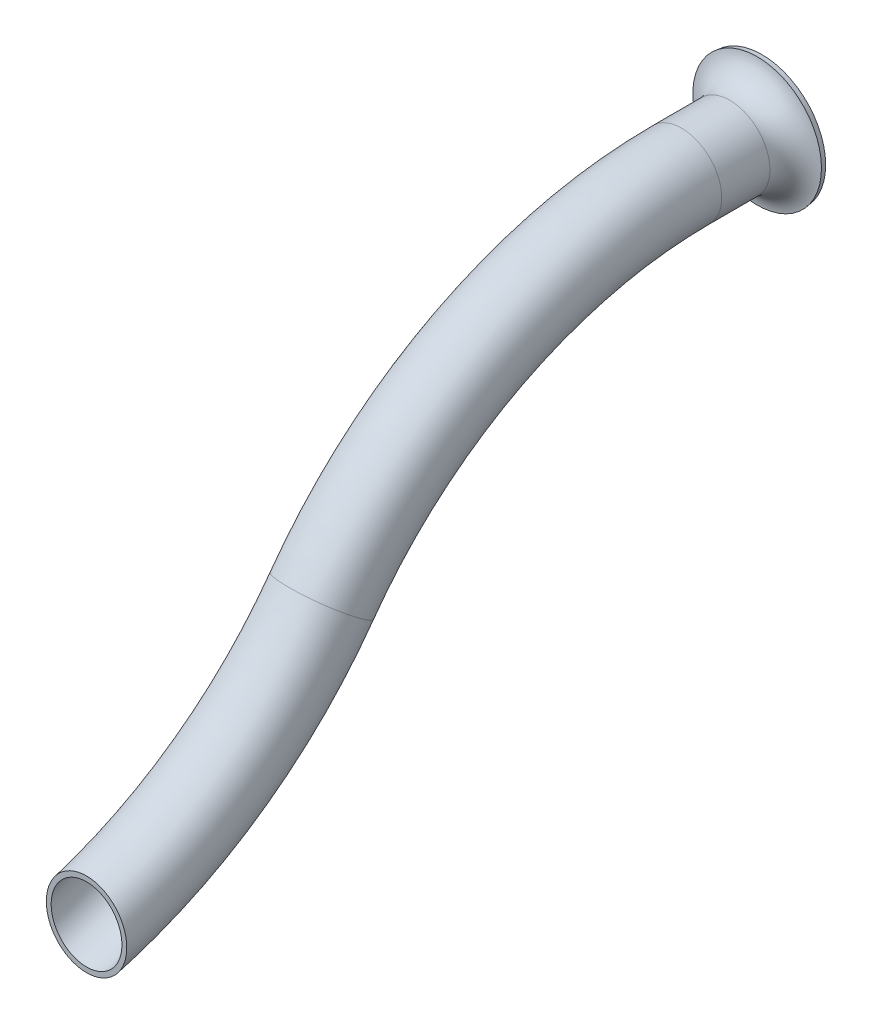
ISO-10303-21;
HEADER;
FILE_DESCRIPTION(('STEP AP214'),'2;1');
FILE_NAME('part.step','',(''),(''),'','','');
FILE_SCHEMA(('AUTOMOTIVE_DESIGN { 1 0 10303 214 1 1 1 1 }'));
ENDSEC;
DATA;
#1=APPLICATION_CONTEXT('core data for automotive mechanical design processes');
#2=APPLICATION_PROTOCOL_DEFINITION('international standard','automotive_design',2000,#1);
#3=PRODUCT_CONTEXT('',#1,'mechanical');
#4=PRODUCT('Part','Part','',(#3));
#5=PRODUCT_RELATED_PRODUCT_CATEGORY('part','',(#4));
#6=PRODUCT_DEFINITION_FORMATION('','',#4);
#7=PRODUCT_DEFINITION_CONTEXT('part definition',#1,'design');
#8=PRODUCT_DEFINITION('design','',#6,#7);
#9=PRODUCT_DEFINITION_SHAPE('','',#8);
#10=(LENGTH_UNIT() NAMED_UNIT(*) SI_UNIT(.MILLI.,.METRE.));
#11=(NAMED_UNIT(*) PLANE_ANGLE_UNIT() SI_UNIT($,.RADIAN.));
#12=(NAMED_UNIT(*) SI_UNIT($,.STERADIAN.) SOLID_ANGLE_UNIT());
#13=UNCERTAINTY_MEASURE_WITH_UNIT(LENGTH_MEASURE(1.E-05),#10,'distance_accuracy_value','');
#14=(GEOMETRIC_REPRESENTATION_CONTEXT(3) GLOBAL_UNCERTAINTY_ASSIGNED_CONTEXT((#13)) GLOBAL_UNIT_ASSIGNED_CONTEXT((#10,
#11,#12)) REPRESENTATION_CONTEXT('',''));
#15=CARTESIAN_POINT('',(0.,0.,0.));
#16=DIRECTION('',(0.,0.,1.));
#17=DIRECTION('',(1.,0.,0.));
#18=AXIS2_PLACEMENT_3D('',#15,#16,#17);
#19=CARTESIAN_POINT('',(0.,27.5,47.7325384926901));
#20=DIRECTION('',(-1.,0.,0.));
#21=DIRECTION('',(0.,0.,1.));
#22=AXIS2_PLACEMENT_3D('',#19,#20,#21);
#23=TOROIDAL_SURFACE('',#22,27.5,2.5);
#24=CARTESIAN_POINT('',(-1.06172313126436,-1.24134183204229,40.));
#25=CARTESIAN_POINT('',(-0.939022530347633,-1.30094035450838,40.));
#26=CARTESIAN_POINT('',(-0.81127379688191,-1.35034169841161,40.));
#27=CARTESIAN_POINT('',(-0.549211398730466,-1.42706629062945,40.));
#28=CARTESIAN_POINT('',(-0.414891788929699,-1.45436913798279,40.));
#29=CARTESIAN_POINT('',(-0.143557732862131,-1.48592976981964,40.));
#30=CARTESIAN_POINT('',(-0.00654329770710844,-1.49018764930623,40.));
#31=CARTESIAN_POINT('',(0.266205699190122,-1.47550736367458,40.));
#32=CARTESIAN_POINT('',(0.401940509279479,-1.45657379695432,40.));
#33=CARTESIAN_POINT('',(0.667662541014182,-1.39630361804151,40.));
#34=CARTESIAN_POINT('',(0.797673694680078,-1.35507229818807,40.));
#35=CARTESIAN_POINT('',(1.04905296188048,-1.25162622153303,40.));
#36=CARTESIAN_POINT('',(1.17042056128685,-1.18941021779974,40.));
#37=CARTESIAN_POINT('',(1.40275490593052,-1.04506645020868,40.));
#38=CARTESIAN_POINT('',(1.51357413314086,-0.962701503085155,40.));
#39=CARTESIAN_POINT('',(1.72029125839508,-0.781010744705187,40.));
#40=CARTESIAN_POINT('',(1.81618736766505,-0.681682903163386,40.));
#41=CARTESIAN_POINT('',(1.9933030997327,-0.465914935499894,40.));
#42=CARTESIAN_POINT('',(2.07402675939926,-0.349067906764672,40.));
#43=CARTESIAN_POINT('',(2.21549430392178,-0.103855491163777,40.));
#44=CARTESIAN_POINT('',(2.27623480998412,0.0245118389132907,40.));
#45=CARTESIAN_POINT('',(2.3782705152099,0.293983243576994,40.));
#46=CARTESIAN_POINT('',(2.41879913994412,0.435377654617741,40.));
#47=CARTESIAN_POINT('',(2.47631233914856,0.722877317710299,40.));
#48=CARTESIAN_POINT('',(2.49329280695306,0.868983386903734,40.));
#49=CARTESIAN_POINT('',(2.50360219532247,1.16642442257825,40.));
#50=CARTESIAN_POINT('',(2.49620683711745,1.31778483931814,40.));
#51=CARTESIAN_POINT('',(2.45641341666228,1.61719534673704,40.));
#52=CARTESIAN_POINT('',(2.4240125650439,1.76524506621107,40.));
#53=CARTESIAN_POINT('',(2.33448069054876,2.05546684531808,40.));
#54=CARTESIAN_POINT('',(2.27708286736804,2.19755683485356,40.));
#55=CARTESIAN_POINT('',(2.13884897761605,2.46986204875517,40.));
#56=CARTESIAN_POINT('',(2.05801385595085,2.60007775157092,40.));
#57=CARTESIAN_POINT('',(1.87645592585456,2.84235271747019,40.));
#58=CARTESIAN_POINT('',(1.77609892707764,2.95468564402163,40.));
#59=CARTESIAN_POINT('',(1.55721986078966,3.16000825446003,40.));
#60=CARTESIAN_POINT('',(1.43870225592063,3.25300267723904,40.));
#61=CARTESIAN_POINT('',(1.19210743833933,3.4127613084054,40.));
#62=CARTESIAN_POINT('',(1.06463367675315,3.48045639868229,40.));
#63=CARTESIAN_POINT('',(0.799743938078063,3.59229942760697,40.));
#64=CARTESIAN_POINT('',(0.662331089504574,3.63645473952857,40.));
#65=CARTESIAN_POINT('',(0.388241158690553,3.69799143353049,40.));
#66=CARTESIAN_POINT('',(0.251817382220529,3.71650406036954,40.));
#67=CARTESIAN_POINT('',(-0.0221703101053225,3.72974658320247,40.));
#68=CARTESIAN_POINT('',(-0.159734025755066,3.72448057060331,40.));
#69=CARTESIAN_POINT('',(-0.428667388305042,3.69078730808685,40.));
#70=CARTESIAN_POINT('',(-0.560106584676125,3.66291059963382,40.));
#71=CARTESIAN_POINT('',(-0.816518451070333,3.58572152163677,40.));
#72=CARTESIAN_POINT('',(-0.941490971370041,3.53640865602815,40.));
#73=CARTESIAN_POINT('',(-1.18303892016106,3.41739354330455,40.));
#74=CARTESIAN_POINT('',(-1.29950475819238,3.34746935093671,40.));
#75=CARTESIAN_POINT('',(-1.51961256310326,3.18974556448057,40.));
#76=CARTESIAN_POINT('',(-1.62325244740064,3.10194307355494,40.));
#77=CARTESIAN_POINT('',(-1.81906271806286,2.90742302866636,40.));
#78=CARTESIAN_POINT('',(-1.91063975202743,2.80010854339718,40.));
#79=CARTESIAN_POINT('',(-2.07541797079594,2.57220050903585,40.));
#80=CARTESIAN_POINT('',(-2.14861505507949,2.45160400537679,40.));
#81=CARTESIAN_POINT('',(-2.27799365337293,2.19467454865322,40.));
#82=CARTESIAN_POINT('',(-2.33324998823242,2.05787536588362,40.));
#83=CARTESIAN_POINT('',(-2.42081179432542,1.7771150865767,40.));
#84=CARTESIAN_POINT('',(-2.45311293180834,1.63315264316173,40.));
#85=CARTESIAN_POINT('',(-2.4946758755989,1.33729762851114,40.));
#86=CARTESIAN_POINT('',(-2.50318020378184,1.18529809084444,40.));
#87=CARTESIAN_POINT('',(-2.49469892515452,0.882004726604266,40.));
#88=CARTESIAN_POINT('',(-2.47771244519772,0.73071092438269,40.));
#89=CARTESIAN_POINT('',(-2.41836822358173,0.432400623338573,40.));
#90=CARTESIAN_POINT('',(-2.37588784624406,0.285408424741601,40.));
#91=CARTESIAN_POINT('',(-2.26631870402796,0.000838038994381855,40.));
#92=CARTESIAN_POINT('',(-2.19922584515995,-0.136738577467274,40.));
#93=CARTESIAN_POINT('',(-2.04366147162628,-0.395401912043248,40.));
#94=CARTESIAN_POINT('',(-1.9556542424749,-0.516767878233821,40.));
#95=CARTESIAN_POINT('',(-1.75988770115623,-0.742189040475703,40.));
#96=CARTESIAN_POINT('',(-1.65215711322557,-0.846268996085682,40.));
#97=CARTESIAN_POINT('',(-1.4630696648549,-0.998899266782454,40.));
#98=CARTESIAN_POINT('',(-1.38670852821142,-1.05374471199098,40.));
#99=CARTESIAN_POINT('',(-1.22826999782935,-1.15445142642184,40.));
#100=CARTESIAN_POINT('',(-1.14619277813644,-1.20031296902781,40.));
#101=CARTESIAN_POINT('',(-1.06172313126436,-1.24134183204229,40.));
#102=B_SPLINE_CURVE_WITH_KNOTS('',3,(#24,#25,#26,#27,#28,#29,#30,#31,#32,#33,#34,#35,#36,#37,
#38,#39,#40,#41,#42,#43,#44,#45,#46,#47,#48,#49,#50,#51,#52,#53,#54,#55,#56,#57,#58,#59,#60,#61,
#62,#63,#64,#65,#66,#67,#68,#69,#70,#71,#72,#73,#74,#75,#76,#77,#78,#79,#80,#81,#82,#83,#84,#85,
#86,#87,#88,#89,#90,#91,#92,#93,#94,#95,#96,#97,#98,#99,#100,#101),.UNSPECIFIED.,.T.,.F.,(4,2,2,
2,2,2,2,2,2,2,2,2,2,2,2,2,2,2,2,2,2,2,2,2,2,2,2,2,2,2,2,2,2,2,2,2,2,2,4),(0.,0.408890847718294,
0.818158747427041,1.22742495992412,1.63661003628577,2.04387955755691,2.45117328347021,
2.86351398764278,3.27590407942339,3.70004302298131,4.12425364403055,4.56351870333756,
5.00286035836344,5.45537246701465,5.90793506078723,6.36545114009168,6.82294877658707,
7.27258094172305,7.72210279451328,8.15290904191517,8.58358027014021,8.99457182915856,
9.40549267472643,9.80669817711797,10.2079129644969,10.6136165722548,11.0193859689302,
11.4407390082856,11.8621859670885,12.3027986946676,12.7434945841871,13.1980669173892,
13.652654821589,14.1094471998198,14.566315594434,15.0138593353348,15.4607564042669,
15.7422539396031,16.0237429075294),.UNSPECIFIED.);
#103=CARTESIAN_POINT('',(-1.06172313126436,-1.24134183204229,40.));
#104=VERTEX_POINT('',#103);
#105=EDGE_CURVE('E52',#104,#104,#102,.T.);
#106=ORIENTED_EDGE('',*,*,#105,.F.);
#107=EDGE_LOOP('',(#106));
#108=FACE_BOUND('',#107,.T.);
#109=CARTESIAN_POINT('',(0.,11.5,25.3662692463451));
#110=DIRECTION('',(0.,-0.813318881685274,0.581818181818182));
#111=DIRECTION('',(1.,0.,0.));
#112=AXIS2_PLACEMENT_3D('',#109,#110,#111);
#113=CIRCLE('',#112,2.5);
#114=CARTESIAN_POINT('',(0.,12.9545454545455,27.3995664505582));
#115=VERTEX_POINT('',#114);
#116=EDGE_CURVE('E10',#115,#115,#113,.T.);
#117=ORIENTED_EDGE('',*,*,#116,.T.);
#118=EDGE_LOOP('',(#117));
#119=FACE_BOUND('',#118,.T.);
#120=ADVANCED_FACE('F30',(#108,#119),#23,.T.);
#121=CARTESIAN_POINT('',(0.,27.5,47.7325384926901));
#122=DIRECTION('',(-1.,0.,0.));
#123=DIRECTION('',(0.,0.,1.));
#124=AXIS2_PLACEMENT_3D('',#121,#122,#123);
#125=TOROIDAL_SURFACE('',#124,27.5,2.2);
#126=CARTESIAN_POINT('',(-0.912557140642565,-0.970415971139715,40.));
#127=CARTESIAN_POINT('',(-0.804115955832809,-1.02163598238834,40.));
#128=CARTESIAN_POINT('',(-0.691333888188574,-1.06384170617826,40.));
#129=CARTESIAN_POINT('',(-0.460209662869494,-1.12877750319061,40.));
#130=CARTESIAN_POINT('',(-0.341862485782662,-1.151489624597,40.));
#131=CARTESIAN_POINT('',(-0.103022419350582,-1.17662811284612,40.));
#132=CARTESIAN_POINT('',(0.0174704308929703,-1.1790548489814,40.));
#133=CARTESIAN_POINT('',(0.257108876768359,-1.16353541579109,40.));
#134=CARTESIAN_POINT('',(0.376254732043836,-1.14559324276181,40.));
#135=CARTESIAN_POINT('',(0.609322857401149,-1.09007524043262,40.));
#136=CARTESIAN_POINT('',(0.723265597632948,-1.05258516693529,40.));
#137=CARTESIAN_POINT('',(0.943360964335266,-0.959252009349359,40.));
#138=CARTESIAN_POINT('',(1.04951309293682,-0.903407753560539,40.));
#139=CARTESIAN_POINT('',(1.25260323425393,-0.774267260026516,40.));
#140=CARTESIAN_POINT('',(1.34939900854856,-0.700747578796966,40.));
#141=CARTESIAN_POINT('',(1.52971602769113,-0.53892978831665,40.));
#142=CARTESIAN_POINT('',(1.61323560671728,-0.450629827369319,40.));
#143=CARTESIAN_POINT('',(1.76730375681513,-0.259015327914163,40.));
#144=CARTESIAN_POINT('',(1.83739636586419,-0.155334355067674,40.));
#145=CARTESIAN_POINT('',(1.95988245371563,0.061995799208866,40.));
#146=CARTESIAN_POINT('',(2.01227287541347,0.175646698145107,40.));
#147=CARTESIAN_POINT('',(2.09983105393433,0.414050720015248,40.));
#148=CARTESIAN_POINT('',(2.13431242374133,0.539056018489258,40.));
#149=CARTESIAN_POINT('',(2.1824644323141,0.79301391956196,40.));
#150=CARTESIAN_POINT('',(2.1961314626387,0.921967202644031,40.));
#151=CARTESIAN_POINT('',(2.20253632772147,1.1841855100852,40.));
#152=CARTESIAN_POINT('',(2.19464894472716,1.31746612461874,40.));
#153=CARTESIAN_POINT('',(2.15683936664579,1.58087616803148,40.));
#154=CARTESIAN_POINT('',(2.1269148928291,1.71100526959332,40.));
#155=CARTESIAN_POINT('',(2.04534525258775,1.96562248799536,40.));
#156=CARTESIAN_POINT('',(1.99350084850591,2.09004695607479,40.));
#157=CARTESIAN_POINT('',(1.86927617901953,2.32820457129702,40.));
#158=CARTESIAN_POINT('',(1.79689701141021,2.44193828953821,40.));
#159=CARTESIAN_POINT('',(1.63492177899682,2.6530341975019,40.));
#160=CARTESIAN_POINT('',(1.54567518437789,2.75066410178958,40.));
#161=CARTESIAN_POINT('',(1.35142247845229,2.92875145007107,40.));
#162=CARTESIAN_POINT('',(1.24642029635742,3.00921316347627,40.));
#163=CARTESIAN_POINT('',(1.02831394865006,3.14700238396066,40.));
#164=CARTESIAN_POINT('',(0.915732499316257,3.20515688757383,40.));
#165=CARTESIAN_POINT('',(0.682087784034188,3.30072998857081,40.));
#166=CARTESIAN_POINT('',(0.561027087521553,3.33815483722667,40.));
#167=CARTESIAN_POINT('',(0.319637902278731,3.38960481494041,40.));
#168=CARTESIAN_POINT('',(0.199513788226648,3.40459155876123,40.));
#169=CARTESIAN_POINT('',(-0.0415140088297174,3.41368390096145,40.));
#170=CARTESIAN_POINT('',(-0.162417563183219,3.40779286149144,40.));
#171=CARTESIAN_POINT('',(-0.398787007297767,3.37572250582935,40.));
#172=CARTESIAN_POINT('',(-0.514313994154585,3.34999015527992,40.));
#173=CARTESIAN_POINT('',(-0.739485155722751,3.27971425951722,40.));
#174=CARTESIAN_POINT('',(-0.849129174776386,3.2351702168409,40.));
#175=CARTESIAN_POINT('',(-1.06091018417202,3.1281710315367,40.));
#176=CARTESIAN_POINT('',(-1.1629432745391,3.06551065639956,40.));
#177=CARTESIAN_POINT('',(-1.35554142088486,2.92453963143701,40.));
#178=CARTESIAN_POINT('',(-1.4461046366183,2.84622647543745,40.));
#179=CARTESIAN_POINT('',(-1.61689078782694,2.67306604862619,40.));
#180=CARTESIAN_POINT('',(-1.69659276153532,2.57770525390933,40.));
#181=CARTESIAN_POINT('',(-1.83967375544376,2.37544261294979,40.));
#182=CARTESIAN_POINT('',(-1.90304919429107,2.26853824181973,40.));
#183=CARTESIAN_POINT('',(-2.01459631485614,2.04111276964578,40.));
#184=CARTESIAN_POINT('',(-2.06196402460025,1.92019704747302,40.));
#185=CARTESIAN_POINT('',(-2.13642268429359,1.67227235435364,40.));
#186=CARTESIAN_POINT('',(-2.16350985212181,1.54526225156224,40.));
#187=CARTESIAN_POINT('',(-2.1973135464743,1.28453697491034,40.));
#188=CARTESIAN_POINT('',(-2.20337210573576,1.15073602429582,40.));
#189=CARTESIAN_POINT('',(-2.19307102707863,0.883993572063462,40.));
#190=CARTESIAN_POINT('',(-2.1767106121122,0.751052100395858,40.));
#191=CARTESIAN_POINT('',(-2.1217103573858,0.489170581876186,40.));
#192=CARTESIAN_POINT('',(-2.08296304308785,0.360253022220223,40.));
#193=CARTESIAN_POINT('',(-1.98390733104611,0.110929947231986,40.));
#194=CARTESIAN_POINT('',(-1.92359533639001,-0.00947414406864753,40.));
#195=CARTESIAN_POINT('',(-1.7843162129912,-0.235571734920408,40.));
#196=CARTESIAN_POINT('',(-1.70575529063145,-0.341515474672068,40.));
#197=CARTESIAN_POINT('',(-1.53141374222376,-0.537982966013982,40.));
#198=CARTESIAN_POINT('',(-1.43565822331345,-0.628528830793376,40.));
#199=CARTESIAN_POINT('',(-1.26787839953809,-0.760999650087055,40.));
#200=CARTESIAN_POINT('',(-1.20019288189619,-0.808514550928604,40.));
#201=CARTESIAN_POINT('',(-1.05987693823105,-0.89558354262882,40.));
#202=CARTESIAN_POINT('',(-0.987246664100954,-0.935137877872805,40.));
#203=CARTESIAN_POINT('',(-0.912557140642565,-0.970415971139715,40.));
#204=B_SPLINE_CURVE_WITH_KNOTS('',3,(#126,#127,#128,#129,#130,#131,#132,#133,#134,#135,#136,
#137,#138,#139,#140,#141,#142,#143,#144,#145,#146,#147,#148,#149,#150,#151,#152,#153,#154,#155,
#156,#157,#158,#159,#160,#161,#162,#163,#164,#165,#166,#167,#168,#169,#170,#171,#172,#173,#174,
#175,#176,#177,#178,#179,#180,#181,#182,#183,#184,#185,#186,#187,#188,#189,#190,#191,#192,#193,
#194,#195,#196,#197,#198,#199,#200,#201,#202,#203),.UNSPECIFIED.,.T.,.F.,(4,2,2,2,2,2,2,2,2,2,2,
2,2,2,2,2,2,2,2,2,2,2,2,2,2,2,2,2,2,2,2,2,2,2,2,2,2,2,4),(0.,0.359491372786692,
0.719313449958876,1.07912897660697,1.43887392112488,1.79705379540446,2.15525653972956,
2.51825054293983,2.88129005669049,3.25505210101695,3.62887865976263,4.01613578206515,
4.40346003287485,4.80213750628917,5.20085621045238,5.60327967125944,6.00568162242834,
6.40051416214647,6.79524839958528,7.17346896711849,7.55157541559405,7.91296086718203,
8.27428812403389,8.6277053566802,8.98113193580245,9.33873070613522,9.696386777707,
10.0675767881778,10.4388481528739,10.8266750254001,11.2145742058098,11.6145061173466,
12.0144518909847,12.4163338609357,12.8182828946701,13.2120218477255,13.6051904797454,
13.8527999448,14.10040180721),.UNSPECIFIED.);
#205=CARTESIAN_POINT('',(-0.912557140642565,-0.970415971139715,40.));
#206=VERTEX_POINT('',#205);
#207=EDGE_CURVE('E34',#206,#206,#204,.T.);
#208=ORIENTED_EDGE('',*,*,#207,.T.);
#209=EDGE_LOOP('',(#208));
#210=FACE_BOUND('',#209,.T.);
#211=CARTESIAN_POINT('',(0.,11.5,25.3662692463451));
#212=DIRECTION('',(0.,-0.813318881685274,0.581818181818182));
#213=DIRECTION('',(1.,0.,0.));
#214=AXIS2_PLACEMENT_3D('',#211,#212,#213);
#215=CIRCLE('',#214,2.2);
#216=CARTESIAN_POINT('',(0.,12.78,27.1555707860527));
#217=VERTEX_POINT('',#216);
#218=EDGE_CURVE('E41',#217,#217,#215,.T.);
#219=ORIENTED_EDGE('',*,*,#218,.F.);
#220=EDGE_LOOP('',(#219));
#221=FACE_BOUND('',#220,.T.);
#222=ADVANCED_FACE('F86',(#210,#221),#125,.F.);
#223=CARTESIAN_POINT('',(0.,-4.49999999999999,3.));
#224=DIRECTION('',(1.,0.,0.));
#225=DIRECTION('',(0.,0.,-1.));
#226=AXIS2_PLACEMENT_3D('',#223,#224,#225);
#227=TOROIDAL_SURFACE('',#226,27.5,2.5);
#228=CARTESIAN_POINT('',(0.,23.,3.00000000000001));
#229=DIRECTION('',(0.,0.,1.));
#230=DIRECTION('',(1.,0.,0.));
#231=AXIS2_PLACEMENT_3D('',#228,#229,#230);
#232=CIRCLE('',#231,2.5);
#233=CARTESIAN_POINT('',(0.,25.5,3.00000000000001));
#234=VERTEX_POINT('',#233);
#235=EDGE_CURVE('E45',#234,#234,#232,.T.);
#236=CARTESIAN_POINT('',(0.,-4.49999999999999,3.));
#237=DIRECTION('',(1.,0.,0.));
#238=DIRECTION('',(0.,0.,-1.));
#239=AXIS2_PLACEMENT_3D('',#236,#237,#238);
#240=CIRCLE('',#239,30.);
#241=EDGE_CURVE('',#234,#115,#240,.T.);
#242=ORIENTED_EDGE('',*,*,#235,.T.);
#243=ORIENTED_EDGE('',*,*,#116,.F.);
#244=ORIENTED_EDGE('',*,*,#241,.T.);
#245=ORIENTED_EDGE('',*,*,#241,.F.);
#246=EDGE_LOOP('',(#242,#244,#243,#245));
#247=FACE_BOUND('',#246,.T.);
#248=ADVANCED_FACE('F83',(#247),#227,.T.);
#249=CARTESIAN_POINT('',(0.,-4.49999999999999,3.));
#250=DIRECTION('',(1.,0.,0.));
#251=DIRECTION('',(0.,0.,-1.));
#252=AXIS2_PLACEMENT_3D('',#249,#250,#251);
#253=TOROIDAL_SURFACE('',#252,27.5,2.2);
#254=CARTESIAN_POINT('',(0.,23.,3.00000000000001));
#255=DIRECTION('',(0.,0.,1.));
#256=DIRECTION('',(1.,0.,0.));
#257=AXIS2_PLACEMENT_3D('',#254,#255,#256);
#258=CIRCLE('',#257,2.2);
#259=CARTESIAN_POINT('',(0.,25.2,3.00000000000001));
#260=VERTEX_POINT('',#259);
#261=EDGE_CURVE('E51',#260,#260,#258,.T.);
#262=CARTESIAN_POINT('',(0.,-4.49999999999999,3.));
#263=DIRECTION('',(1.,0.,0.));
#264=DIRECTION('',(0.,0.,-1.));
#265=AXIS2_PLACEMENT_3D('',#262,#263,#264);
#266=CIRCLE('',#265,29.7);
#267=EDGE_CURVE('',#260,#217,#266,.T.);
#268=ORIENTED_EDGE('',*,*,#261,.F.);
#269=ORIENTED_EDGE('',*,*,#218,.T.);
#270=ORIENTED_EDGE('',*,*,#267,.T.);
#271=ORIENTED_EDGE('',*,*,#267,.F.);
#272=EDGE_LOOP('',(#268,#270,#269,#271));
#273=FACE_BOUND('',#272,.T.);
#274=ADVANCED_FACE('F79',(#273),#253,.F.);
#275=CARTESIAN_POINT('',(0.,23.,3.00000000000001));
#276=DIRECTION('',(0.,0.,-1.));
#277=DIRECTION('',(0.,1.,0.));
#278=AXIS2_PLACEMENT_3D('',#275,#276,#277);
#279=CYLINDRICAL_SURFACE('',#278,2.2);
#280=ORIENTED_EDGE('',*,*,#261,.T.);
#281=EDGE_LOOP('',(#280));
#282=FACE_BOUND('',#281,.T.);
#283=CARTESIAN_POINT('',(0.,23.,0.));
#284=DIRECTION('',(0.,0.,1.));
#285=DIRECTION('',(1.,0.,0.));
#286=AXIS2_PLACEMENT_3D('',#283,#284,#285);
#287=CIRCLE('',#286,2.2);
#288=CARTESIAN_POINT('',(2.2,23.,0.));
#289=VERTEX_POINT('',#288);
#290=EDGE_CURVE('E48',#289,#289,#287,.T.);
#291=ORIENTED_EDGE('',*,*,#290,.F.);
#292=EDGE_LOOP('',(#291));
#293=FACE_BOUND('',#292,.T.);
#294=ADVANCED_FACE('F75',(#282,#293),#279,.F.);
#295=CARTESIAN_POINT('',(0.,23.,3.00000000000001));
#296=DIRECTION('',(0.,0.,-1.));
#297=DIRECTION('',(0.,1.,0.));
#298=AXIS2_PLACEMENT_3D('',#295,#296,#297);
#299=CYLINDRICAL_SURFACE('',#298,2.5);
#300=ORIENTED_EDGE('',*,*,#235,.F.);
#301=EDGE_LOOP('',(#300));
#302=FACE_BOUND('',#301,.T.);
#303=CARTESIAN_POINT('',(0.,23.,0.));
#304=DIRECTION('',(0.,0.,1.));
#305=DIRECTION('',(1.,0.,0.));
#306=AXIS2_PLACEMENT_3D('',#303,#304,#305);
#307=CIRCLE('',#306,2.5);
#308=CARTESIAN_POINT('',(2.5,23.,0.));
#309=VERTEX_POINT('',#308);
#310=EDGE_CURVE('E61',#309,#309,#307,.T.);
#311=ORIENTED_EDGE('',*,*,#310,.T.);
#312=EDGE_LOOP('',(#311));
#313=FACE_BOUND('',#312,.T.);
#314=ADVANCED_FACE('F69',(#302,#313),#299,.T.);
#315=CARTESIAN_POINT('',(-5.,-2.5,40.));
#316=DIRECTION('',(0.,0.,-1.));
#317=DIRECTION('',(-1.,0.,0.));
#318=AXIS2_PLACEMENT_3D('',#315,#316,#317);
#319=PLANE('',#318);
#320=ORIENTED_EDGE('',*,*,#105,.T.);
#321=EDGE_LOOP('',(#320));
#322=FACE_BOUND('',#321,.T.);
#323=ORIENTED_EDGE('',*,*,#207,.F.);
#324=EDGE_LOOP('',(#323));
#325=FACE_BOUND('',#324,.T.);
#326=ADVANCED_FACE('F63',(#322,#325),#319,.F.);
#327=CARTESIAN_POINT('',(0.,23.,0.));
#328=DIRECTION('',(0.,0.,1.));
#329=DIRECTION('',(1.,0.,0.));
#330=AXIS2_PLACEMENT_3D('',#327,#328,#329);
#331=TOROIDAL_SURFACE('',#330,4.21604040532927,1.71604040532928);
#332=ORIENTED_EDGE('',*,*,#310,.F.);
#333=EDGE_LOOP('',(#332));
#334=FACE_BOUND('',#333,.T.);
#335=CARTESIAN_POINT('',(0.,23.,-1.70238691723939));
#336=DIRECTION('',(0.,0.,1.));
#337=DIRECTION('',(1.,0.,0.));
#338=AXIS2_PLACEMENT_3D('',#335,#336,#337);
#339=CIRCLE('',#338,4.);
#340=CARTESIAN_POINT('',(4.,23.,-1.70238691723939));
#341=VERTEX_POINT('',#340);
#342=EDGE_CURVE('E106',#341,#341,#339,.T.);
#343=ORIENTED_EDGE('',*,*,#342,.T.);
#344=EDGE_LOOP('',(#343));
#345=FACE_BOUND('',#344,.T.);
#346=ADVANCED_FACE('F68',(#334,#345),#331,.F.);
#347=CARTESIAN_POINT('',(0.,23.,0.));
#348=DIRECTION('',(0.,0.,1.));
#349=DIRECTION('',(1.,0.,0.));
#350=AXIS2_PLACEMENT_3D('',#347,#348,#349);
#351=TOROIDAL_SURFACE('',#350,4.21604040532927,2.01604040532927);
#352=CARTESIAN_POINT('',(0.,23.,-2.));
#353=DIRECTION('',(0.,0.,1.));
#354=DIRECTION('',(1.,0.,0.));
#355=AXIS2_PLACEMENT_3D('',#352,#353,#354);
#356=CIRCLE('',#355,3.9622315876727);
#357=CARTESIAN_POINT('',(3.9622315876727,23.,-2.));
#358=VERTEX_POINT('',#357);
#359=EDGE_CURVE('E102',#358,#358,#356,.T.);
#360=ORIENTED_EDGE('',*,*,#359,.F.);
#361=EDGE_LOOP('',(#360));
#362=FACE_BOUND('',#361,.T.);
#363=ORIENTED_EDGE('',*,*,#290,.T.);
#364=EDGE_LOOP('',(#363));
#365=FACE_BOUND('',#364,.T.);
#366=ADVANCED_FACE('F116',(#362,#365),#351,.T.);
#367=CARTESIAN_POINT('',(0.,23.,-2.));
#368=DIRECTION('',(0.,0.,1.));
#369=DIRECTION('',(1.,0.,0.));
#370=AXIS2_PLACEMENT_3D('',#367,#368,#369);
#371=CONICAL_SURFACE('',#370,3.9622315876727,0.126229663179774);
#372=ORIENTED_EDGE('',*,*,#342,.F.);
#373=EDGE_LOOP('',(#372));
#374=FACE_BOUND('',#373,.T.);
#375=ORIENTED_EDGE('',*,*,#359,.T.);
#376=EDGE_LOOP('',(#375));
#377=FACE_BOUND('',#376,.T.);
#378=ADVANCED_FACE('F114',(#374,#377),#371,.T.);
#379=CLOSED_SHELL('',(#120,#222,#248,#274,#294,#314,#326,#346,#366,#378));
#380=MANIFOLD_SOLID_BREP('B2',#379);
#381=ADVANCED_BREP_SHAPE_REPRESENTATION('',(#18,#380),#14);
#382=SHAPE_DEFINITION_REPRESENTATION(#9,#381);
ENDSEC;
END-ISO-10303-21;
